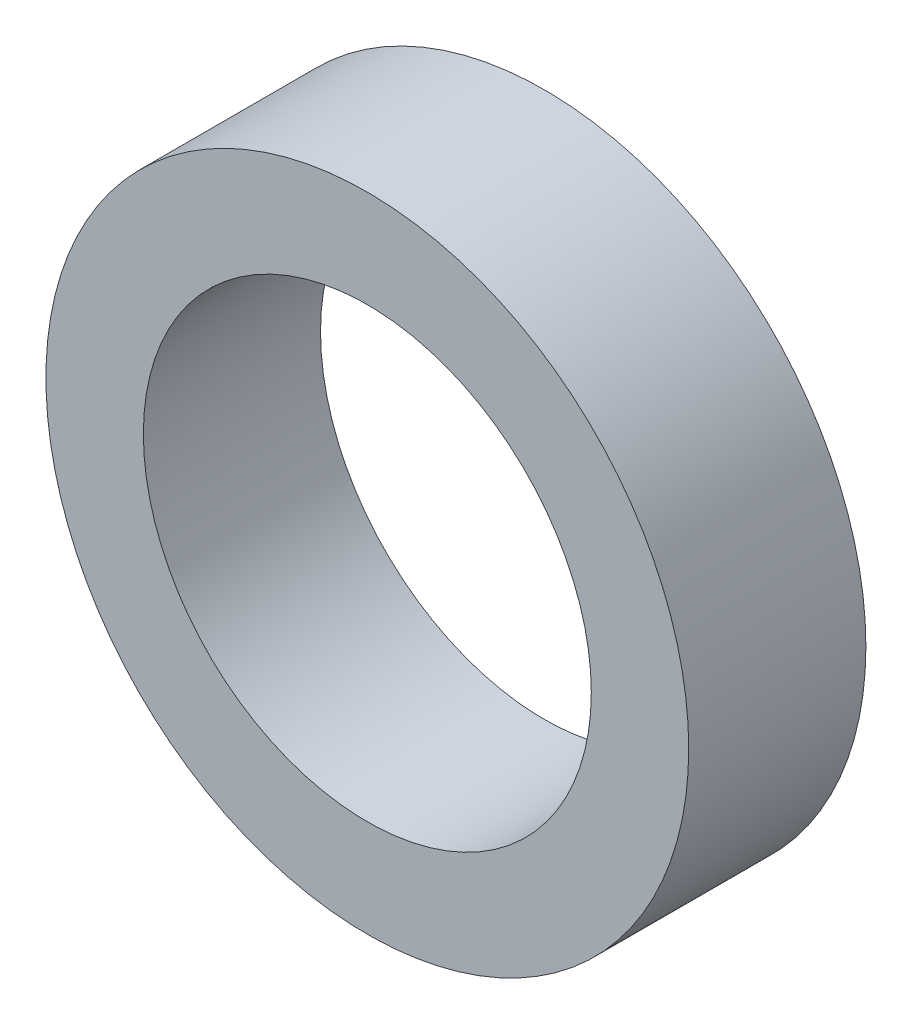
ISO-10303-21;
HEADER;
FILE_DESCRIPTION(('STEP AP214'),'2;1');
FILE_NAME('part.step','',(''),(''),'','','');
FILE_SCHEMA(('AUTOMOTIVE_DESIGN { 1 0 10303 214 1 1 1 1 }'));
ENDSEC;
DATA;
#1=APPLICATION_CONTEXT('core data for automotive mechanical design processes');
#2=APPLICATION_PROTOCOL_DEFINITION('international standard','automotive_design',2000,#1);
#3=PRODUCT_CONTEXT('',#1,'mechanical');
#4=PRODUCT('Part','Part','',(#3));
#5=PRODUCT_RELATED_PRODUCT_CATEGORY('part','',(#4));
#6=PRODUCT_DEFINITION_FORMATION('','',#4);
#7=PRODUCT_DEFINITION_CONTEXT('part definition',#1,'design');
#8=PRODUCT_DEFINITION('design','',#6,#7);
#9=PRODUCT_DEFINITION_SHAPE('','',#8);
#10=(LENGTH_UNIT() NAMED_UNIT(*) SI_UNIT(.MILLI.,.METRE.));
#11=(NAMED_UNIT(*) PLANE_ANGLE_UNIT() SI_UNIT($,.RADIAN.));
#12=(NAMED_UNIT(*) SI_UNIT($,.STERADIAN.) SOLID_ANGLE_UNIT());
#13=UNCERTAINTY_MEASURE_WITH_UNIT(LENGTH_MEASURE(1.E-05),#10,'distance_accuracy_value','');
#14=(GEOMETRIC_REPRESENTATION_CONTEXT(3) GLOBAL_UNCERTAINTY_ASSIGNED_CONTEXT((#13)) GLOBAL_UNIT_ASSIGNED_CONTEXT((#10,
#11,#12)) REPRESENTATION_CONTEXT('',''));
#15=CARTESIAN_POINT('',(0.,0.,0.));
#16=DIRECTION('',(0.,0.,1.));
#17=DIRECTION('',(1.,0.,0.));
#18=AXIS2_PLACEMENT_3D('',#15,#16,#17);
#19=CARTESIAN_POINT('',(0.,0.,35.));
#20=DIRECTION('',(0.,0.,1.));
#21=DIRECTION('',(1.,0.,0.));
#22=AXIS2_PLACEMENT_3D('',#19,#20,#21);
#23=PLANE('',#22);
#24=CARTESIAN_POINT('',(0.,0.,35.));
#25=DIRECTION('',(0.,0.,1.));
#26=DIRECTION('',(1.,0.,0.));
#27=AXIS2_PLACEMENT_3D('',#24,#25,#26);
#28=CIRCLE('',#27,127.);
#29=CARTESIAN_POINT('',(127.,0.,35.));
#30=VERTEX_POINT('',#29);
#31=EDGE_CURVE('E10',#30,#30,#28,.T.);
#32=ORIENTED_EDGE('',*,*,#31,.T.);
#33=EDGE_LOOP('',(#32));
#34=FACE_BOUND('',#33,.T.);
#35=CARTESIAN_POINT('',(0.,0.,35.));
#36=DIRECTION('',(0.,0.,1.));
#37=DIRECTION('',(1.,0.,0.));
#38=AXIS2_PLACEMENT_3D('',#35,#36,#37);
#39=CIRCLE('',#38,88.5);
#40=CARTESIAN_POINT('',(88.5,0.,35.));
#41=VERTEX_POINT('',#40);
#42=EDGE_CURVE('E51',#41,#41,#39,.T.);
#43=ORIENTED_EDGE('',*,*,#42,.F.);
#44=EDGE_LOOP('',(#43));
#45=FACE_BOUND('',#44,.T.);
#46=ADVANCED_FACE('F36',(#34,#45),#23,.T.);
#47=CARTESIAN_POINT('',(0.,0.,-35.));
#48=DIRECTION('',(0.,0.,1.));
#49=DIRECTION('',(1.,0.,0.));
#50=AXIS2_PLACEMENT_3D('',#47,#48,#49);
#51=PLANE('',#50);
#52=CARTESIAN_POINT('',(0.,0.,-35.));
#53=DIRECTION('',(0.,0.,1.));
#54=DIRECTION('',(1.,0.,0.));
#55=AXIS2_PLACEMENT_3D('',#52,#53,#54);
#56=CIRCLE('',#55,127.);
#57=CARTESIAN_POINT('',(127.,0.,-35.));
#58=VERTEX_POINT('',#57);
#59=EDGE_CURVE('E40',#58,#58,#56,.T.);
#60=ORIENTED_EDGE('',*,*,#59,.F.);
#61=EDGE_LOOP('',(#60));
#62=FACE_BOUND('',#61,.T.);
#63=CARTESIAN_POINT('',(0.,0.,-35.));
#64=DIRECTION('',(0.,0.,1.));
#65=DIRECTION('',(1.,0.,0.));
#66=AXIS2_PLACEMENT_3D('',#63,#64,#65);
#67=CIRCLE('',#66,88.5);
#68=CARTESIAN_POINT('',(88.5,0.,-35.));
#69=VERTEX_POINT('',#68);
#70=EDGE_CURVE('E53',#69,#69,#67,.T.);
#71=ORIENTED_EDGE('',*,*,#70,.T.);
#72=EDGE_LOOP('',(#71));
#73=FACE_BOUND('',#72,.T.);
#74=ADVANCED_FACE('F63',(#62,#73),#51,.F.);
#75=CARTESIAN_POINT('',(0.,0.,35.));
#76=DIRECTION('',(0.,0.,-1.));
#77=DIRECTION('',(-1.,0.,0.));
#78=AXIS2_PLACEMENT_3D('',#75,#76,#77);
#79=CYLINDRICAL_SURFACE('',#78,127.);
#80=ORIENTED_EDGE('',*,*,#31,.F.);
#81=EDGE_LOOP('',(#80));
#82=FACE_BOUND('',#81,.T.);
#83=ORIENTED_EDGE('',*,*,#59,.T.);
#84=EDGE_LOOP('',(#83));
#85=FACE_BOUND('',#84,.T.);
#86=ADVANCED_FACE('F38',(#82,#85),#79,.T.);
#87=CARTESIAN_POINT('',(0.,0.,35.));
#88=DIRECTION('',(0.,0.,-1.));
#89=DIRECTION('',(-1.,0.,0.));
#90=AXIS2_PLACEMENT_3D('',#87,#88,#89);
#91=CYLINDRICAL_SURFACE('',#90,88.5);
#92=ORIENTED_EDGE('',*,*,#42,.T.);
#93=EDGE_LOOP('',(#92));
#94=FACE_BOUND('',#93,.T.);
#95=ORIENTED_EDGE('',*,*,#70,.F.);
#96=EDGE_LOOP('',(#95));
#97=FACE_BOUND('',#96,.T.);
#98=ADVANCED_FACE('F59',(#94,#97),#91,.F.);
#99=CLOSED_SHELL('',(#46,#74,#86,#98));
#100=MANIFOLD_SOLID_BREP('B2',#99);
#101=ADVANCED_BREP_SHAPE_REPRESENTATION('',(#18,#100),#14);
#102=SHAPE_DEFINITION_REPRESENTATION(#9,#101);
ENDSEC;
END-ISO-10303-21;
